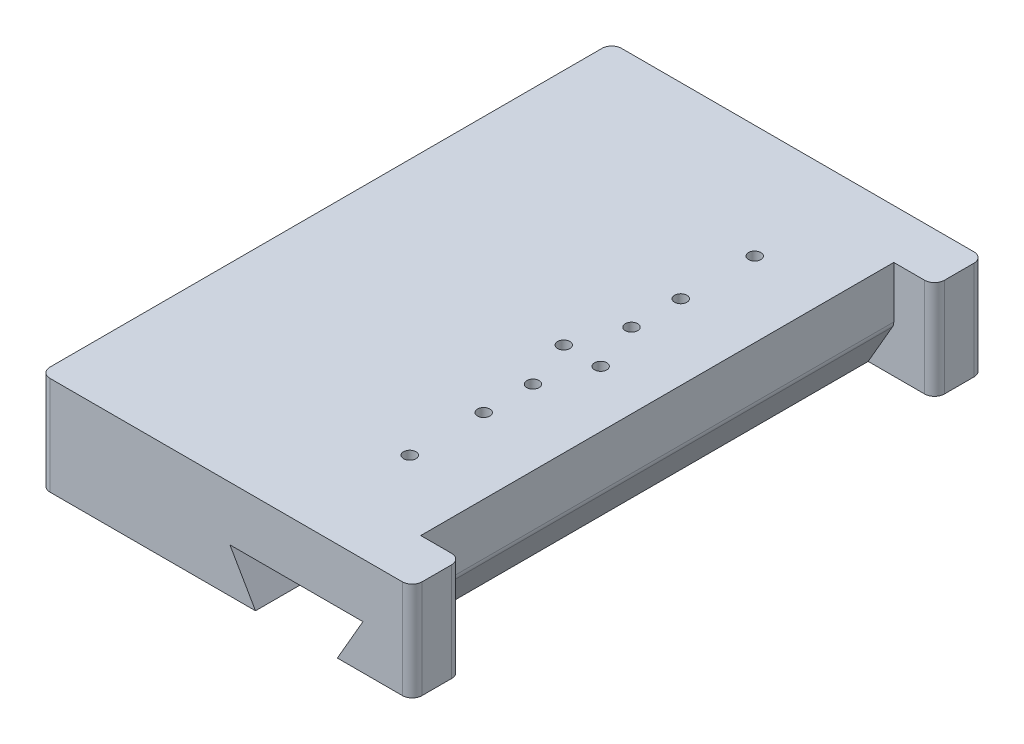
ISO-10303-21;
HEADER;
FILE_DESCRIPTION(('STEP AP214'),'2;1');
FILE_NAME('part.step','',(''),(''),'','','');
FILE_SCHEMA(('AUTOMOTIVE_DESIGN { 1 0 10303 214 1 1 1 1 }'));
ENDSEC;
DATA;
#1=APPLICATION_CONTEXT('core data for automotive mechanical design processes');
#2=APPLICATION_PROTOCOL_DEFINITION('international standard','automotive_design',2000,#1);
#3=PRODUCT_CONTEXT('',#1,'mechanical');
#4=PRODUCT('Part','Part','',(#3));
#5=PRODUCT_RELATED_PRODUCT_CATEGORY('part','',(#4));
#6=PRODUCT_DEFINITION_FORMATION('','',#4);
#7=PRODUCT_DEFINITION_CONTEXT('part definition',#1,'design');
#8=PRODUCT_DEFINITION('design','',#6,#7);
#9=PRODUCT_DEFINITION_SHAPE('','',#8);
#10=(LENGTH_UNIT() NAMED_UNIT(*) SI_UNIT(.MILLI.,.METRE.));
#11=(NAMED_UNIT(*) PLANE_ANGLE_UNIT() SI_UNIT($,.RADIAN.));
#12=(NAMED_UNIT(*) SI_UNIT($,.STERADIAN.) SOLID_ANGLE_UNIT());
#13=UNCERTAINTY_MEASURE_WITH_UNIT(LENGTH_MEASURE(1.E-05),#10,'distance_accuracy_value','');
#14=(GEOMETRIC_REPRESENTATION_CONTEXT(3) GLOBAL_UNCERTAINTY_ASSIGNED_CONTEXT((#13)) GLOBAL_UNIT_ASSIGNED_CONTEXT((#10,
#11,#12)) REPRESENTATION_CONTEXT('',''));
#15=CARTESIAN_POINT('',(0.,0.,0.));
#16=DIRECTION('',(0.,0.,1.));
#17=DIRECTION('',(1.,0.,0.));
#18=AXIS2_PLACEMENT_3D('',#15,#16,#17);
#19=CARTESIAN_POINT('',(0.,-20.,0.));
#20=DIRECTION('',(0.,1.,0.));
#21=DIRECTION('',(0.,0.,1.));
#22=AXIS2_PLACEMENT_3D('',#19,#20,#21);
#23=PLANE('',#22);
#24=DIRECTION('',(1.,0.,0.));
#25=VECTOR('',#24,1.);
#26=CARTESIAN_POINT('',(100.,-20.,48.));
#27=LINE('',#26,#25);
#28=CARTESIAN_POINT('',(62.0358983848623,-20.,48.));
#29=VERTEX_POINT('',#28);
#30=CARTESIAN_POINT('',(73.5,-20.,48.));
#31=VERTEX_POINT('',#30);
#32=EDGE_CURVE('E221',#29,#31,#27,.T.);
#33=ORIENTED_EDGE('',*,*,#32,.T.);
#34=CARTESIAN_POINT('',(73.5,-20.,50.));
#35=DIRECTION('',(0.,1.,0.));
#36=DIRECTION('',(0.,0.,1.));
#37=AXIS2_PLACEMENT_3D('',#34,#35,#36);
#38=CIRCLE('',#37,2.);
#39=CARTESIAN_POINT('',(75.5,-20.,50.));
#40=VERTEX_POINT('',#39);
#41=EDGE_CURVE('E410',#31,#40,#38,.F.);
#42=ORIENTED_EDGE('',*,*,#41,.T.);
#43=DIRECTION('',(0.,0.,1.));
#44=VECTOR('',#43,1.);
#45=CARTESIAN_POINT('',(75.5,-20.,-58.));
#46=LINE('',#45,#44);
#47=CARTESIAN_POINT('',(75.5,-20.,56.));
#48=VERTEX_POINT('',#47);
#49=EDGE_CURVE('E447',#40,#48,#46,.T.);
#50=ORIENTED_EDGE('',*,*,#49,.T.);
#51=CARTESIAN_POINT('',(73.5,-20.,56.));
#52=DIRECTION('',(0.,1.,0.));
#53=DIRECTION('',(0.,0.,1.));
#54=AXIS2_PLACEMENT_3D('',#51,#52,#53);
#55=CIRCLE('',#54,2.);
#56=CARTESIAN_POINT('',(73.5,-20.,58.));
#57=VERTEX_POINT('',#56);
#58=EDGE_CURVE('E60',#48,#57,#55,.F.);
#59=ORIENTED_EDGE('',*,*,#58,.T.);
#60=DIRECTION('',(-1.,0.,0.));
#61=VECTOR('',#60,1.);
#62=CARTESIAN_POINT('',(0.,-20.,58.));
#63=LINE('',#62,#61);
#64=CARTESIAN_POINT('',(60.3038475772934,-20.,58.));
#65=VERTEX_POINT('',#64);
#66=EDGE_CURVE('E294',#57,#65,#63,.T.);
#67=ORIENTED_EDGE('',*,*,#66,.T.);
#68=DIRECTION('',(0.,0.,-1.));
#69=VECTOR('',#68,1.);
#70=CARTESIAN_POINT('',(60.3038475772934,-20.,0.));
#71=LINE('',#70,#69);
#72=CARTESIAN_POINT('',(60.3038475772934,-20.,-58.));
#73=VERTEX_POINT('',#72);
#74=EDGE_CURVE('E339',#65,#73,#71,.T.);
#75=ORIENTED_EDGE('',*,*,#74,.T.);
#76=DIRECTION('',(-1.,0.,0.));
#77=VECTOR('',#76,1.);
#78=CARTESIAN_POINT('',(0.,-20.,-58.));
#79=LINE('',#78,#77);
#80=CARTESIAN_POINT('',(73.5,-20.,-58.));
#81=VERTEX_POINT('',#80);
#82=EDGE_CURVE('E285',#81,#73,#79,.T.);
#83=ORIENTED_EDGE('',*,*,#82,.F.);
#84=CARTESIAN_POINT('',(73.5,-20.,-56.));
#85=DIRECTION('',(0.,1.,0.));
#86=DIRECTION('',(0.,0.,1.));
#87=AXIS2_PLACEMENT_3D('',#84,#85,#86);
#88=CIRCLE('',#87,2.);
#89=CARTESIAN_POINT('',(75.5,-20.,-56.));
#90=VERTEX_POINT('',#89);
#91=EDGE_CURVE('E403',#81,#90,#88,.F.);
#92=ORIENTED_EDGE('',*,*,#91,.T.);
#93=CARTESIAN_POINT('',(75.5,-20.,-50.));
#94=VERTEX_POINT('',#93);
#95=EDGE_CURVE('E443',#90,#94,#46,.T.);
#96=ORIENTED_EDGE('',*,*,#95,.T.);
#97=CARTESIAN_POINT('',(73.5,-20.,-50.));
#98=DIRECTION('',(0.,1.,0.));
#99=DIRECTION('',(0.,0.,1.));
#100=AXIS2_PLACEMENT_3D('',#97,#98,#99);
#101=CIRCLE('',#100,2.);
#102=CARTESIAN_POINT('',(73.5,-20.,-48.));
#103=VERTEX_POINT('',#102);
#104=EDGE_CURVE('E67',#94,#103,#101,.F.);
#105=ORIENTED_EDGE('',*,*,#104,.T.);
#106=DIRECTION('',(-1.,0.,0.));
#107=VECTOR('',#106,1.);
#108=CARTESIAN_POINT('',(100.,-20.,-48.));
#109=LINE('',#108,#107);
#110=CARTESIAN_POINT('',(62.0358983848623,-20.,-48.));
#111=VERTEX_POINT('',#110);
#112=EDGE_CURVE('E179',#103,#111,#109,.T.);
#113=ORIENTED_EDGE('',*,*,#112,.T.);
#114=DIRECTION('',(0.,0.,-1.));
#115=VECTOR('',#114,1.);
#116=CARTESIAN_POINT('',(62.0358983848624,-20.,100.910057229565));
#117=LINE('',#116,#115);
#118=EDGE_CURVE('E182',#29,#111,#117,.T.);
#119=ORIENTED_EDGE('',*,*,#118,.F.);
#120=EDGE_LOOP('',(#33,#42,#50,#59,#67,#75,#83,#92,#96,#105,#113,#119));
#121=FACE_BOUND('',#120,.T.);
#122=ADVANCED_FACE('F44',(#121),#23,.F.);
#123=CARTESIAN_POINT('',(0.,-20.,-58.));
#124=DIRECTION('',(0.,0.,-1.));
#125=DIRECTION('',(-1.,0.,0.));
#126=AXIS2_PLACEMENT_3D('',#123,#124,#125);
#127=PLANE('',#126);
#128=DIRECTION('',(-1.,0.,0.));
#129=VECTOR('',#128,1.);
#130=CARTESIAN_POINT('',(0.,0.,-58.));
#131=LINE('',#130,#129);
#132=CARTESIAN_POINT('',(73.5,0.,-58.));
#133=VERTEX_POINT('',#132);
#134=CARTESIAN_POINT('',(2.,0.,-58.));
#135=VERTEX_POINT('',#134);
#136=EDGE_CURVE('E281',#133,#135,#131,.T.);
#137=ORIENTED_EDGE('',*,*,#136,.F.);
#138=DIRECTION('',(0.,-1.,0.));
#139=VECTOR('',#138,1.);
#140=CARTESIAN_POINT('',(73.5,-20.,-58.));
#141=LINE('',#140,#139);
#142=EDGE_CURVE('E425',#133,#81,#141,.T.);
#143=ORIENTED_EDGE('',*,*,#142,.T.);
#144=ORIENTED_EDGE('',*,*,#82,.T.);
#145=DIRECTION('',(0.499999999999995,0.866025403784442,0.));
#146=VECTOR('',#145,1.);
#147=CARTESIAN_POINT('',(65.5,-11.,-58.));
#148=LINE('',#147,#146);
#149=CARTESIAN_POINT('',(65.5,-11.,-58.));
#150=VERTEX_POINT('',#149);
#151=EDGE_CURVE('E263',#73,#150,#148,.T.);
#152=ORIENTED_EDGE('',*,*,#151,.T.);
#153=DIRECTION('',(-1.,0.,0.));
#154=VECTOR('',#153,1.);
#155=CARTESIAN_POINT('',(38.7886751345948,-11.,-58.));
#156=LINE('',#155,#154);
#157=CARTESIAN_POINT('',(38.5,-11.,-58.));
#158=VERTEX_POINT('',#157);
#159=EDGE_CURVE('E254',#150,#158,#156,.T.);
#160=ORIENTED_EDGE('',*,*,#159,.T.);
#161=DIRECTION('',(0.499999999999995,-0.866025403784442,0.));
#162=VECTOR('',#161,1.);
#163=CARTESIAN_POINT('',(38.5,-11.,-58.));
#164=LINE('',#163,#162);
#165=CARTESIAN_POINT('',(43.6961524227066,-20.,-58.));
#166=VERTEX_POINT('',#165);
#167=EDGE_CURVE('E258',#158,#166,#164,.T.);
#168=ORIENTED_EDGE('',*,*,#167,.T.);
#169=CARTESIAN_POINT('',(2.,-20.,-58.));
#170=VERTEX_POINT('',#169);
#171=EDGE_CURVE('E289',#166,#170,#79,.T.);
#172=ORIENTED_EDGE('',*,*,#171,.T.);
#173=DIRECTION('',(0.,1.,0.));
#174=VECTOR('',#173,1.);
#175=CARTESIAN_POINT('',(2.,-20.,-58.));
#176=LINE('',#175,#174);
#177=EDGE_CURVE('E297',#170,#135,#176,.T.);
#178=ORIENTED_EDGE('',*,*,#177,.T.);
#179=EDGE_LOOP('',(#137,#143,#144,#152,#160,#168,#172,#178));
#180=FACE_BOUND('',#179,.T.);
#181=ADVANCED_FACE('F490',(#180),#127,.T.);
#182=CARTESIAN_POINT('',(0.,-20.,58.));
#183=DIRECTION('',(0.,0.,-1.));
#184=DIRECTION('',(-1.,0.,0.));
#185=AXIS2_PLACEMENT_3D('',#182,#183,#184);
#186=PLANE('',#185);
#187=ORIENTED_EDGE('',*,*,#66,.F.);
#188=DIRECTION('',(0.,-1.,0.));
#189=VECTOR('',#188,1.);
#190=CARTESIAN_POINT('',(73.5,-20.,58.));
#191=LINE('',#190,#189);
#192=CARTESIAN_POINT('',(73.5,0.,58.));
#193=VERTEX_POINT('',#192);
#194=EDGE_CURVE('E422',#57,#193,#191,.F.);
#195=ORIENTED_EDGE('',*,*,#194,.T.);
#196=DIRECTION('',(-1.,0.,0.));
#197=VECTOR('',#196,1.);
#198=CARTESIAN_POINT('',(0.,0.,58.));
#199=LINE('',#198,#197);
#200=CARTESIAN_POINT('',(2.,0.,58.));
#201=VERTEX_POINT('',#200);
#202=EDGE_CURVE('E304',#193,#201,#199,.T.);
#203=ORIENTED_EDGE('',*,*,#202,.T.);
#204=DIRECTION('',(0.,1.,0.));
#205=VECTOR('',#204,1.);
#206=CARTESIAN_POINT('',(2.,-20.,58.));
#207=LINE('',#206,#205);
#208=CARTESIAN_POINT('',(2.,-20.,58.));
#209=VERTEX_POINT('',#208);
#210=EDGE_CURVE('E331',#201,#209,#207,.F.);
#211=ORIENTED_EDGE('',*,*,#210,.T.);
#212=CARTESIAN_POINT('',(43.6961524227066,-20.,58.));
#213=VERTEX_POINT('',#212);
#214=EDGE_CURVE('E293',#213,#209,#63,.T.);
#215=ORIENTED_EDGE('',*,*,#214,.F.);
#216=DIRECTION('',(0.499999999999995,-0.866025403784442,0.));
#217=VECTOR('',#216,1.);
#218=CARTESIAN_POINT('',(38.5,-11.,58.));
#219=LINE('',#218,#217);
#220=CARTESIAN_POINT('',(38.5,-11.,58.));
#221=VERTEX_POINT('',#220);
#222=EDGE_CURVE('E268',#221,#213,#219,.T.);
#223=ORIENTED_EDGE('',*,*,#222,.F.);
#224=DIRECTION('',(-1.,0.,0.));
#225=VECTOR('',#224,1.);
#226=CARTESIAN_POINT('',(38.7886751345948,-11.,58.));
#227=LINE('',#226,#225);
#228=CARTESIAN_POINT('',(65.5,-11.,58.));
#229=VERTEX_POINT('',#228);
#230=EDGE_CURVE('E259',#229,#221,#227,.T.);
#231=ORIENTED_EDGE('',*,*,#230,.F.);
#232=DIRECTION('',(0.499999999999995,0.866025403784442,0.));
#233=VECTOR('',#232,1.);
#234=CARTESIAN_POINT('',(65.5,-11.,58.));
#235=LINE('',#234,#233);
#236=EDGE_CURVE('E271',#65,#229,#235,.T.);
#237=ORIENTED_EDGE('',*,*,#236,.F.);
#238=EDGE_LOOP('',(#187,#195,#203,#211,#215,#223,#231,#237));
#239=FACE_BOUND('',#238,.T.);
#240=ADVANCED_FACE('F468',(#239),#186,.F.);
#241=CARTESIAN_POINT('',(0.,-20.,0.));
#242=DIRECTION('',(-1.,0.,0.));
#243=DIRECTION('',(0.,0.,1.));
#244=AXIS2_PLACEMENT_3D('',#241,#242,#243);
#245=PLANE('',#244);
#246=DIRECTION('',(0.,0.,1.));
#247=VECTOR('',#246,1.);
#248=CARTESIAN_POINT('',(0.,0.,0.));
#249=LINE('',#248,#247);
#250=CARTESIAN_POINT('',(0.,0.,-56.));
#251=VERTEX_POINT('',#250);
#252=CARTESIAN_POINT('',(0.,0.,56.));
#253=VERTEX_POINT('',#252);
#254=EDGE_CURVE('E300',#251,#253,#249,.T.);
#255=ORIENTED_EDGE('',*,*,#254,.F.);
#256=DIRECTION('',(0.,1.,0.));
#257=VECTOR('',#256,1.);
#258=CARTESIAN_POINT('',(0.,-20.,-56.));
#259=LINE('',#258,#257);
#260=CARTESIAN_POINT('',(0.,-20.,-56.));
#261=VERTEX_POINT('',#260);
#262=EDGE_CURVE('E321',#251,#261,#259,.F.);
#263=ORIENTED_EDGE('',*,*,#262,.T.);
#264=DIRECTION('',(0.,0.,1.));
#265=VECTOR('',#264,1.);
#266=CARTESIAN_POINT('',(0.,-20.,0.));
#267=LINE('',#266,#265);
#268=CARTESIAN_POINT('',(0.,-20.,56.));
#269=VERTEX_POINT('',#268);
#270=EDGE_CURVE('E288',#261,#269,#267,.T.);
#271=ORIENTED_EDGE('',*,*,#270,.T.);
#272=DIRECTION('',(0.,1.,0.));
#273=VECTOR('',#272,1.);
#274=CARTESIAN_POINT('',(0.,0.,56.));
#275=LINE('',#274,#273);
#276=EDGE_CURVE('E317',#269,#253,#275,.T.);
#277=ORIENTED_EDGE('',*,*,#276,.T.);
#278=EDGE_LOOP('',(#255,#263,#271,#277));
#279=FACE_BOUND('',#278,.T.);
#280=ADVANCED_FACE('F536',(#279),#245,.T.);
#281=ORIENTED_EDGE('',*,*,#171,.F.);
#282=DIRECTION('',(0.,0.,1.));
#283=VECTOR('',#282,1.);
#284=CARTESIAN_POINT('',(43.6961524227066,-20.,0.));
#285=LINE('',#284,#283);
#286=EDGE_CURVE('E335',#166,#213,#285,.T.);
#287=ORIENTED_EDGE('',*,*,#286,.T.);
#288=ORIENTED_EDGE('',*,*,#214,.T.);
#289=CARTESIAN_POINT('',(2.,-20.,56.));
#290=DIRECTION('',(0.,1.,0.));
#291=DIRECTION('',(0.,0.,1.));
#292=AXIS2_PLACEMENT_3D('',#289,#290,#291);
#293=CIRCLE('',#292,2.);
#294=EDGE_CURVE('E324',#209,#269,#293,.F.);
#295=ORIENTED_EDGE('',*,*,#294,.T.);
#296=ORIENTED_EDGE('',*,*,#270,.F.);
#297=CARTESIAN_POINT('',(2.,-20.,-56.));
#298=DIRECTION('',(0.,1.,0.));
#299=DIRECTION('',(0.,0.,1.));
#300=AXIS2_PLACEMENT_3D('',#297,#298,#299);
#301=CIRCLE('',#300,2.);
#302=EDGE_CURVE('E327',#261,#170,#301,.F.);
#303=ORIENTED_EDGE('',*,*,#302,.T.);
#304=EDGE_LOOP('',(#281,#287,#288,#295,#296,#303));
#305=FACE_BOUND('',#304,.T.);
#306=ADVANCED_FACE('F483',(#305),#23,.F.);
#307=CARTESIAN_POINT('',(0.,0.,0.));
#308=DIRECTION('',(0.,1.,0.));
#309=DIRECTION('',(0.,0.,1.));
#310=AXIS2_PLACEMENT_3D('',#307,#308,#309);
#311=PLANE('',#310);
#312=DIRECTION('',(0.,0.,1.));
#313=VECTOR('',#312,1.);
#314=CARTESIAN_POINT('',(75.5,0.,-58.));
#315=LINE('',#314,#313);
#316=CARTESIAN_POINT('',(75.5,0.,50.));
#317=VERTEX_POINT('',#316);
#318=CARTESIAN_POINT('',(75.5,0.,56.));
#319=VERTEX_POINT('',#318);
#320=EDGE_CURVE('E446',#317,#319,#315,.T.);
#321=ORIENTED_EDGE('',*,*,#320,.F.);
#322=CARTESIAN_POINT('',(73.5,0.,50.));
#323=DIRECTION('',(0.,1.,0.));
#324=DIRECTION('',(0.,0.,1.));
#325=AXIS2_PLACEMENT_3D('',#322,#323,#324);
#326=CIRCLE('',#325,2.);
#327=CARTESIAN_POINT('',(73.5,0.,48.));
#328=VERTEX_POINT('',#327);
#329=EDGE_CURVE('E397',#317,#328,#326,.T.);
#330=ORIENTED_EDGE('',*,*,#329,.T.);
#331=DIRECTION('',(-1.,0.,0.));
#332=VECTOR('',#331,1.);
#333=CARTESIAN_POINT('',(67.232050807569,0.,48.));
#334=LINE('',#333,#332);
#335=CARTESIAN_POINT('',(67.232050807569,0.,48.));
#336=VERTEX_POINT('',#335);
#337=EDGE_CURVE('E433',#328,#336,#334,.T.);
#338=ORIENTED_EDGE('',*,*,#337,.T.);
#339=DIRECTION('',(0.,0.,-1.));
#340=VECTOR('',#339,1.);
#341=CARTESIAN_POINT('',(67.232050807569,0.,100.910057229565));
#342=LINE('',#341,#340);
#343=CARTESIAN_POINT('',(67.2320508075689,0.,-48.));
#344=VERTEX_POINT('',#343);
#345=EDGE_CURVE('E199',#336,#344,#342,.T.);
#346=ORIENTED_EDGE('',*,*,#345,.T.);
#347=DIRECTION('',(1.,0.,0.));
#348=VECTOR('',#347,1.);
#349=CARTESIAN_POINT('',(67.2320508075689,0.,-48.));
#350=LINE('',#349,#348);
#351=CARTESIAN_POINT('',(73.5,0.,-48.));
#352=VERTEX_POINT('',#351);
#353=EDGE_CURVE('E200',#344,#352,#350,.T.);
#354=ORIENTED_EDGE('',*,*,#353,.T.);
#355=CARTESIAN_POINT('',(73.5,0.,-50.));
#356=DIRECTION('',(0.,1.,0.));
#357=DIRECTION('',(0.,0.,1.));
#358=AXIS2_PLACEMENT_3D('',#355,#356,#357);
#359=CIRCLE('',#358,2.);
#360=CARTESIAN_POINT('',(75.5,0.,-50.));
#361=VERTEX_POINT('',#360);
#362=EDGE_CURVE('E394',#352,#361,#359,.T.);
#363=ORIENTED_EDGE('',*,*,#362,.T.);
#364=CARTESIAN_POINT('',(75.5,0.,-56.));
#365=VERTEX_POINT('',#364);
#366=EDGE_CURVE('E189',#365,#361,#315,.T.);
#367=ORIENTED_EDGE('',*,*,#366,.F.);
#368=CARTESIAN_POINT('',(73.5,0.,-56.));
#369=DIRECTION('',(0.,1.,0.));
#370=DIRECTION('',(0.,0.,1.));
#371=AXIS2_PLACEMENT_3D('',#368,#369,#370);
#372=CIRCLE('',#371,2.);
#373=EDGE_CURVE('E388',#365,#133,#372,.T.);
#374=ORIENTED_EDGE('',*,*,#373,.T.);
#375=ORIENTED_EDGE('',*,*,#136,.T.);
#376=CARTESIAN_POINT('',(2.,0.,-56.));
#377=DIRECTION('',(0.,1.,0.));
#378=DIRECTION('',(0.,0.,1.));
#379=AXIS2_PLACEMENT_3D('',#376,#377,#378);
#380=CIRCLE('',#379,2.);
#381=EDGE_CURVE('E314',#135,#251,#380,.T.);
#382=ORIENTED_EDGE('',*,*,#381,.T.);
#383=ORIENTED_EDGE('',*,*,#254,.T.);
#384=CARTESIAN_POINT('',(2.,0.,56.));
#385=DIRECTION('',(0.,1.,0.));
#386=DIRECTION('',(0.,0.,1.));
#387=AXIS2_PLACEMENT_3D('',#384,#385,#386);
#388=CIRCLE('',#387,2.);
#389=EDGE_CURVE('E310',#253,#201,#388,.T.);
#390=ORIENTED_EDGE('',*,*,#389,.T.);
#391=ORIENTED_EDGE('',*,*,#202,.F.);
#392=CARTESIAN_POINT('',(73.5,0.,56.));
#393=DIRECTION('',(0.,1.,0.));
#394=DIRECTION('',(0.,0.,1.));
#395=AXIS2_PLACEMENT_3D('',#392,#393,#394);
#396=CIRCLE('',#395,2.);
#397=EDGE_CURVE('E391',#193,#319,#396,.T.);
#398=ORIENTED_EDGE('',*,*,#397,.T.);
#399=EDGE_LOOP('',(#321,#330,#338,#346,#354,#363,#367,#374,#375,#382,#383,#390,#391,#398));
#400=FACE_BOUND('',#399,.T.);
#401=CARTESIAN_POINT('',(52.,0.,10.));
#402=DIRECTION('',(0.,1.,0.));
#403=DIRECTION('',(0.,0.,-1.));
#404=AXIS2_PLACEMENT_3D('',#401,#402,#403);
#405=CIRCLE('',#404,1.25);
#406=CARTESIAN_POINT('',(52.,0.,8.75));
#407=VERTEX_POINT('',#406);
#408=EDGE_CURVE('E220',#407,#407,#405,.T.);
#409=ORIENTED_EDGE('',*,*,#408,.F.);
#410=EDGE_LOOP('',(#409));
#411=FACE_BOUND('',#410,.T.);
#412=CARTESIAN_POINT('',(52.,0.,20.));
#413=DIRECTION('',(0.,1.,0.));
#414=DIRECTION('',(0.,0.,-1.));
#415=AXIS2_PLACEMENT_3D('',#412,#413,#414);
#416=CIRCLE('',#415,1.25);
#417=CARTESIAN_POINT('',(52.,0.,18.75));
#418=VERTEX_POINT('',#417);
#419=EDGE_CURVE('E243',#418,#418,#416,.T.);
#420=ORIENTED_EDGE('',*,*,#419,.F.);
#421=EDGE_LOOP('',(#420));
#422=FACE_BOUND('',#421,.T.);
#423=CARTESIAN_POINT('',(52.,0.,35.));
#424=DIRECTION('',(0.,1.,0.));
#425=DIRECTION('',(0.,0.,-1.));
#426=AXIS2_PLACEMENT_3D('',#423,#424,#425);
#427=CIRCLE('',#426,1.25);
#428=CARTESIAN_POINT('',(52.,0.,33.75));
#429=VERTEX_POINT('',#428);
#430=EDGE_CURVE('E231',#429,#429,#427,.T.);
#431=ORIENTED_EDGE('',*,*,#430,.F.);
#432=EDGE_LOOP('',(#431));
#433=FACE_BOUND('',#432,.T.);
#434=CARTESIAN_POINT('',(52.,0.,-20.));
#435=DIRECTION('',(0.,1.,0.));
#436=DIRECTION('',(0.,0.,1.));
#437=AXIS2_PLACEMENT_3D('',#434,#435,#436);
#438=CIRCLE('',#437,1.25);
#439=CARTESIAN_POINT('',(52.,0.,-18.75));
#440=VERTEX_POINT('',#439);
#441=EDGE_CURVE('E232',#440,#440,#438,.T.);
#442=ORIENTED_EDGE('',*,*,#441,.F.);
#443=EDGE_LOOP('',(#442));
#444=FACE_BOUND('',#443,.T.);
#445=CARTESIAN_POINT('',(48.25,0.,0.));
#446=DIRECTION('',(0.,1.,0.));
#447=DIRECTION('',(0.,0.,1.));
#448=AXIS2_PLACEMENT_3D('',#445,#446,#447);
#449=CIRCLE('',#448,1.25);
#450=CARTESIAN_POINT('',(48.25,0.,1.25));
#451=VERTEX_POINT('',#450);
#452=EDGE_CURVE('E226',#451,#451,#449,.T.);
#453=ORIENTED_EDGE('',*,*,#452,.F.);
#454=EDGE_LOOP('',(#453));
#455=FACE_BOUND('',#454,.T.);
#456=CARTESIAN_POINT('',(55.75,0.,0.));
#457=DIRECTION('',(0.,1.,0.));
#458=DIRECTION('',(0.,0.,1.));
#459=AXIS2_PLACEMENT_3D('',#456,#457,#458);
#460=CIRCLE('',#459,1.25);
#461=CARTESIAN_POINT('',(55.75,0.,1.25));
#462=VERTEX_POINT('',#461);
#463=EDGE_CURVE('E222',#462,#462,#460,.T.);
#464=ORIENTED_EDGE('',*,*,#463,.F.);
#465=EDGE_LOOP('',(#464));
#466=FACE_BOUND('',#465,.T.);
#467=CARTESIAN_POINT('',(52.,0.,-35.));
#468=DIRECTION('',(0.,1.,0.));
#469=DIRECTION('',(0.,0.,1.));
#470=AXIS2_PLACEMENT_3D('',#467,#468,#469);
#471=CIRCLE('',#470,1.25);
#472=CARTESIAN_POINT('',(52.,0.,-33.75));
#473=VERTEX_POINT('',#472);
#474=EDGE_CURVE('E227',#473,#473,#471,.T.);
#475=ORIENTED_EDGE('',*,*,#474,.F.);
#476=EDGE_LOOP('',(#475));
#477=FACE_BOUND('',#476,.T.);
#478=CARTESIAN_POINT('',(52.,0.,-10.));
#479=DIRECTION('',(0.,1.,0.));
#480=DIRECTION('',(0.,0.,1.));
#481=AXIS2_PLACEMENT_3D('',#478,#479,#480);
#482=CIRCLE('',#481,1.25);
#483=CARTESIAN_POINT('',(52.,0.,-8.75));
#484=VERTEX_POINT('',#483);
#485=EDGE_CURVE('E236',#484,#484,#482,.T.);
#486=ORIENTED_EDGE('',*,*,#485,.F.);
#487=EDGE_LOOP('',(#486));
#488=FACE_BOUND('',#487,.T.);
#489=ADVANCED_FACE('F470',(#400,#411,#422,#433,#444,#455,#466,#477,#488),#311,.T.);
#490=CARTESIAN_POINT('',(2.,-20.,-56.));
#491=DIRECTION('',(0.,1.,0.));
#492=DIRECTION('',(0.,0.,1.));
#493=AXIS2_PLACEMENT_3D('',#490,#491,#492);
#494=CYLINDRICAL_SURFACE('',#493,2.);
#495=ORIENTED_EDGE('',*,*,#302,.F.);
#496=ORIENTED_EDGE('',*,*,#262,.F.);
#497=ORIENTED_EDGE('',*,*,#381,.F.);
#498=ORIENTED_EDGE('',*,*,#177,.F.);
#499=EDGE_LOOP('',(#495,#496,#497,#498));
#500=FACE_BOUND('',#499,.T.);
#501=ADVANCED_FACE('F541',(#500),#494,.T.);
#502=CARTESIAN_POINT('',(2.,-20.,56.));
#503=DIRECTION('',(0.,-1.,0.));
#504=DIRECTION('',(0.,0.,-1.));
#505=AXIS2_PLACEMENT_3D('',#502,#503,#504);
#506=CYLINDRICAL_SURFACE('',#505,2.);
#507=ORIENTED_EDGE('',*,*,#294,.F.);
#508=ORIENTED_EDGE('',*,*,#210,.F.);
#509=ORIENTED_EDGE('',*,*,#389,.F.);
#510=ORIENTED_EDGE('',*,*,#276,.F.);
#511=EDGE_LOOP('',(#507,#508,#509,#510));
#512=FACE_BOUND('',#511,.T.);
#513=ADVANCED_FACE('F477',(#512),#506,.T.);
#514=CARTESIAN_POINT('',(65.5,-11.,-58.));
#515=DIRECTION('',(0.866025403784442,-0.499999999999995,0.));
#516=DIRECTION('',(0.499999999999995,0.866025403784442,0.));
#517=AXIS2_PLACEMENT_3D('',#514,#515,#516);
#518=PLANE('',#517);
#519=ORIENTED_EDGE('',*,*,#236,.T.);
#520=DIRECTION('',(0.,0.,1.));
#521=VECTOR('',#520,1.);
#522=CARTESIAN_POINT('',(65.5,-11.,-58.));
#523=LINE('',#522,#521);
#524=EDGE_CURVE('E277',#150,#229,#523,.T.);
#525=ORIENTED_EDGE('',*,*,#524,.F.);
#526=ORIENTED_EDGE('',*,*,#151,.F.);
#527=ORIENTED_EDGE('',*,*,#74,.F.);
#528=EDGE_LOOP('',(#519,#525,#526,#527));
#529=FACE_BOUND('',#528,.T.);
#530=ADVANCED_FACE('F496',(#529),#518,.F.);
#531=CARTESIAN_POINT('',(38.5,-11.,-58.));
#532=DIRECTION('',(-0.866025403784441,-0.499999999999995,0.));
#533=DIRECTION('',(0.499999999999995,-0.866025403784442,0.));
#534=AXIS2_PLACEMENT_3D('',#531,#532,#533);
#535=PLANE('',#534);
#536=ORIENTED_EDGE('',*,*,#167,.F.);
#537=DIRECTION('',(0.,0.,1.));
#538=VECTOR('',#537,1.);
#539=CARTESIAN_POINT('',(38.5,-11.,-58.));
#540=LINE('',#539,#538);
#541=EDGE_CURVE('E267',#158,#221,#540,.T.);
#542=ORIENTED_EDGE('',*,*,#541,.T.);
#543=ORIENTED_EDGE('',*,*,#222,.T.);
#544=ORIENTED_EDGE('',*,*,#286,.F.);
#545=EDGE_LOOP('',(#536,#542,#543,#544));
#546=FACE_BOUND('',#545,.T.);
#547=ADVANCED_FACE('F487',(#546),#535,.F.);
#548=CARTESIAN_POINT('',(38.7886751345948,-11.,-58.));
#549=DIRECTION('',(0.,1.,0.));
#550=DIRECTION('',(-1.,0.,0.));
#551=AXIS2_PLACEMENT_3D('',#548,#549,#550);
#552=PLANE('',#551);
#553=CARTESIAN_POINT('',(52.,-11.,10.));
#554=DIRECTION('',(0.,1.,0.));
#555=DIRECTION('',(-1.,0.,0.));
#556=AXIS2_PLACEMENT_3D('',#553,#554,#555);
#557=CIRCLE('',#556,1.25);
#558=CARTESIAN_POINT('',(50.75,-11.,10.));
#559=VERTEX_POINT('',#558);
#560=EDGE_CURVE('E272',#559,#559,#557,.T.);
#561=ORIENTED_EDGE('',*,*,#560,.T.);
#562=EDGE_LOOP('',(#561));
#563=FACE_BOUND('',#562,.T.);
#564=CARTESIAN_POINT('',(52.,-11.,20.));
#565=DIRECTION('',(0.,1.,0.));
#566=DIRECTION('',(-1.,0.,0.));
#567=AXIS2_PLACEMENT_3D('',#564,#565,#566);
#568=CIRCLE('',#567,1.25);
#569=CARTESIAN_POINT('',(50.75,-11.,20.));
#570=VERTEX_POINT('',#569);
#571=EDGE_CURVE('E367',#570,#570,#568,.T.);
#572=ORIENTED_EDGE('',*,*,#571,.T.);
#573=EDGE_LOOP('',(#572));
#574=FACE_BOUND('',#573,.T.);
#575=CARTESIAN_POINT('',(52.,-11.,35.));
#576=DIRECTION('',(0.,1.,0.));
#577=DIRECTION('',(-1.,0.,0.));
#578=AXIS2_PLACEMENT_3D('',#575,#576,#577);
#579=CIRCLE('',#578,1.25);
#580=CARTESIAN_POINT('',(50.75,-11.,35.));
#581=VERTEX_POINT('',#580);
#582=EDGE_CURVE('E363',#581,#581,#579,.T.);
#583=ORIENTED_EDGE('',*,*,#582,.T.);
#584=EDGE_LOOP('',(#583));
#585=FACE_BOUND('',#584,.T.);
#586=CARTESIAN_POINT('',(52.,-11.,-20.));
#587=DIRECTION('',(0.,1.,0.));
#588=DIRECTION('',(-1.,0.,0.));
#589=AXIS2_PLACEMENT_3D('',#586,#587,#588);
#590=CIRCLE('',#589,1.25);
#591=CARTESIAN_POINT('',(50.75,-11.,-20.));
#592=VERTEX_POINT('',#591);
#593=EDGE_CURVE('E359',#592,#592,#590,.T.);
#594=ORIENTED_EDGE('',*,*,#593,.T.);
#595=EDGE_LOOP('',(#594));
#596=FACE_BOUND('',#595,.T.);
#597=CARTESIAN_POINT('',(48.25,-11.,0.));
#598=DIRECTION('',(0.,1.,0.));
#599=DIRECTION('',(-1.,0.,0.));
#600=AXIS2_PLACEMENT_3D('',#597,#598,#599);
#601=CIRCLE('',#600,1.25);
#602=CARTESIAN_POINT('',(47.,-11.,0.));
#603=VERTEX_POINT('',#602);
#604=EDGE_CURVE('E355',#603,#603,#601,.T.);
#605=ORIENTED_EDGE('',*,*,#604,.T.);
#606=EDGE_LOOP('',(#605));
#607=FACE_BOUND('',#606,.T.);
#608=CARTESIAN_POINT('',(55.75,-11.,0.));
#609=DIRECTION('',(0.,1.,0.));
#610=DIRECTION('',(-1.,0.,0.));
#611=AXIS2_PLACEMENT_3D('',#608,#609,#610);
#612=CIRCLE('',#611,1.25);
#613=CARTESIAN_POINT('',(54.5,-11.,0.));
#614=VERTEX_POINT('',#613);
#615=EDGE_CURVE('E351',#614,#614,#612,.T.);
#616=ORIENTED_EDGE('',*,*,#615,.T.);
#617=EDGE_LOOP('',(#616));
#618=FACE_BOUND('',#617,.T.);
#619=CARTESIAN_POINT('',(52.,-11.,-35.));
#620=DIRECTION('',(0.,1.,0.));
#621=DIRECTION('',(-1.,0.,0.));
#622=AXIS2_PLACEMENT_3D('',#619,#620,#621);
#623=CIRCLE('',#622,1.25);
#624=CARTESIAN_POINT('',(50.75,-11.,-35.));
#625=VERTEX_POINT('',#624);
#626=EDGE_CURVE('E347',#625,#625,#623,.T.);
#627=ORIENTED_EDGE('',*,*,#626,.T.);
#628=EDGE_LOOP('',(#627));
#629=FACE_BOUND('',#628,.T.);
#630=CARTESIAN_POINT('',(52.,-11.,-10.));
#631=DIRECTION('',(0.,1.,0.));
#632=DIRECTION('',(-1.,0.,0.));
#633=AXIS2_PLACEMENT_3D('',#630,#631,#632);
#634=CIRCLE('',#633,1.25);
#635=CARTESIAN_POINT('',(50.75,-11.,-10.));
#636=VERTEX_POINT('',#635);
#637=EDGE_CURVE('E253',#636,#636,#634,.T.);
#638=ORIENTED_EDGE('',*,*,#637,.T.);
#639=EDGE_LOOP('',(#638));
#640=FACE_BOUND('',#639,.T.);
#641=ORIENTED_EDGE('',*,*,#230,.T.);
#642=ORIENTED_EDGE('',*,*,#541,.F.);
#643=ORIENTED_EDGE('',*,*,#159,.F.);
#644=ORIENTED_EDGE('',*,*,#524,.T.);
#645=EDGE_LOOP('',(#641,#642,#643,#644));
#646=FACE_BOUND('',#645,.T.);
#647=ADVANCED_FACE('F494',(#563,#574,#585,#596,#607,#618,#629,#640,#646),#552,.F.);
#648=CARTESIAN_POINT('',(52.,-20.,-10.));
#649=DIRECTION('',(0.,1.,0.));
#650=DIRECTION('',(0.,0.,1.));
#651=AXIS2_PLACEMENT_3D('',#648,#649,#650);
#652=CYLINDRICAL_SURFACE('',#651,1.25);
#653=ORIENTED_EDGE('',*,*,#485,.T.);
#654=EDGE_LOOP('',(#653));
#655=FACE_BOUND('',#654,.T.);
#656=ORIENTED_EDGE('',*,*,#637,.F.);
#657=EDGE_LOOP('',(#656));
#658=FACE_BOUND('',#657,.T.);
#659=ADVANCED_FACE('F562',(#655,#658),#652,.F.);
#660=CARTESIAN_POINT('',(52.,-20.,-35.));
#661=DIRECTION('',(0.,1.,0.));
#662=DIRECTION('',(0.,0.,1.));
#663=AXIS2_PLACEMENT_3D('',#660,#661,#662);
#664=CYLINDRICAL_SURFACE('',#663,1.25);
#665=ORIENTED_EDGE('',*,*,#474,.T.);
#666=EDGE_LOOP('',(#665));
#667=FACE_BOUND('',#666,.T.);
#668=ORIENTED_EDGE('',*,*,#626,.F.);
#669=EDGE_LOOP('',(#668));
#670=FACE_BOUND('',#669,.T.);
#671=ADVANCED_FACE('F566',(#667,#670),#664,.F.);
#672=CARTESIAN_POINT('',(55.75,-20.,0.));
#673=DIRECTION('',(0.,1.,0.));
#674=DIRECTION('',(0.,0.,1.));
#675=AXIS2_PLACEMENT_3D('',#672,#673,#674);
#676=CYLINDRICAL_SURFACE('',#675,1.25);
#677=ORIENTED_EDGE('',*,*,#463,.T.);
#678=EDGE_LOOP('',(#677));
#679=FACE_BOUND('',#678,.T.);
#680=ORIENTED_EDGE('',*,*,#615,.F.);
#681=EDGE_LOOP('',(#680));
#682=FACE_BOUND('',#681,.T.);
#683=ADVANCED_FACE('F584',(#679,#682),#676,.F.);
#684=CARTESIAN_POINT('',(48.25,-20.,0.));
#685=DIRECTION('',(0.,1.,0.));
#686=DIRECTION('',(0.,0.,1.));
#687=AXIS2_PLACEMENT_3D('',#684,#685,#686);
#688=CYLINDRICAL_SURFACE('',#687,1.25);
#689=ORIENTED_EDGE('',*,*,#452,.T.);
#690=EDGE_LOOP('',(#689));
#691=FACE_BOUND('',#690,.T.);
#692=ORIENTED_EDGE('',*,*,#604,.F.);
#693=EDGE_LOOP('',(#692));
#694=FACE_BOUND('',#693,.T.);
#695=ADVANCED_FACE('F581',(#691,#694),#688,.F.);
#696=CARTESIAN_POINT('',(52.,-20.,-20.));
#697=DIRECTION('',(0.,1.,0.));
#698=DIRECTION('',(0.,0.,1.));
#699=AXIS2_PLACEMENT_3D('',#696,#697,#698);
#700=CYLINDRICAL_SURFACE('',#699,1.25);
#701=ORIENTED_EDGE('',*,*,#441,.T.);
#702=EDGE_LOOP('',(#701));
#703=FACE_BOUND('',#702,.T.);
#704=ORIENTED_EDGE('',*,*,#593,.F.);
#705=EDGE_LOOP('',(#704));
#706=FACE_BOUND('',#705,.T.);
#707=ADVANCED_FACE('F579',(#703,#706),#700,.F.);
#708=CARTESIAN_POINT('',(52.,-20.,35.));
#709=DIRECTION('',(0.,1.,0.));
#710=DIRECTION('',(0.,0.,1.));
#711=AXIS2_PLACEMENT_3D('',#708,#709,#710);
#712=CYLINDRICAL_SURFACE('',#711,1.25);
#713=ORIENTED_EDGE('',*,*,#430,.T.);
#714=EDGE_LOOP('',(#713));
#715=FACE_BOUND('',#714,.T.);
#716=ORIENTED_EDGE('',*,*,#582,.F.);
#717=EDGE_LOOP('',(#716));
#718=FACE_BOUND('',#717,.T.);
#719=ADVANCED_FACE('F575',(#715,#718),#712,.F.);
#720=CARTESIAN_POINT('',(52.,-20.,20.));
#721=DIRECTION('',(0.,1.,0.));
#722=DIRECTION('',(0.,0.,1.));
#723=AXIS2_PLACEMENT_3D('',#720,#721,#722);
#724=CYLINDRICAL_SURFACE('',#723,1.25);
#725=ORIENTED_EDGE('',*,*,#419,.T.);
#726=EDGE_LOOP('',(#725));
#727=FACE_BOUND('',#726,.T.);
#728=ORIENTED_EDGE('',*,*,#571,.F.);
#729=EDGE_LOOP('',(#728));
#730=FACE_BOUND('',#729,.T.);
#731=ADVANCED_FACE('F571',(#727,#730),#724,.F.);
#732=CARTESIAN_POINT('',(52.,-20.,10.));
#733=DIRECTION('',(0.,1.,0.));
#734=DIRECTION('',(0.,0.,1.));
#735=AXIS2_PLACEMENT_3D('',#732,#733,#734);
#736=CYLINDRICAL_SURFACE('',#735,1.25);
#737=ORIENTED_EDGE('',*,*,#408,.T.);
#738=EDGE_LOOP('',(#737));
#739=FACE_BOUND('',#738,.T.);
#740=ORIENTED_EDGE('',*,*,#560,.F.);
#741=EDGE_LOOP('',(#740));
#742=FACE_BOUND('',#741,.T.);
#743=ADVANCED_FACE('F568',(#739,#742),#736,.F.);
#744=CARTESIAN_POINT('',(67.232050807569,-11.,100.910057229565));
#745=DIRECTION('',(-1.,0.,0.));
#746=DIRECTION('',(0.,0.,1.));
#747=AXIS2_PLACEMENT_3D('',#744,#745,#746);
#748=PLANE('',#747);
#749=DIRECTION('',(0.,-1.,0.));
#750=VECTOR('',#749,1.);
#751=CARTESIAN_POINT('',(67.232050807569,-11.,48.));
#752=LINE('',#751,#750);
#753=CARTESIAN_POINT('',(67.232050807569,-10.4641016151378,48.));
#754=VERTEX_POINT('',#753);
#755=EDGE_CURVE('E216',#336,#754,#752,.T.);
#756=ORIENTED_EDGE('',*,*,#755,.T.);
#757=DIRECTION('',(0.,0.,-1.));
#758=VECTOR('',#757,1.);
#759=CARTESIAN_POINT('',(67.232050807569,-10.4641016151378,100.910057229565));
#760=LINE('',#759,#758);
#761=CARTESIAN_POINT('',(67.2320508075689,-10.4641016151378,-48.));
#762=VERTEX_POINT('',#761);
#763=EDGE_CURVE('E343',#754,#762,#760,.T.);
#764=ORIENTED_EDGE('',*,*,#763,.T.);
#765=DIRECTION('',(0.,1.,0.));
#766=VECTOR('',#765,1.);
#767=CARTESIAN_POINT('',(67.2320508075689,-11.,-48.));
#768=LINE('',#767,#766);
#769=EDGE_CURVE('E205',#762,#344,#768,.T.);
#770=ORIENTED_EDGE('',*,*,#769,.T.);
#771=ORIENTED_EDGE('',*,*,#345,.F.);
#772=EDGE_LOOP('',(#756,#764,#770,#771));
#773=FACE_BOUND('',#772,.T.);
#774=ADVANCED_FACE('F509',(#773),#748,.F.);
#775=CARTESIAN_POINT('',(62.0358983848624,-20.,100.910057229565));
#776=DIRECTION('',(-0.866025403784439,0.5,0.));
#777=DIRECTION('',(-0.5,-0.866025403784439,0.));
#778=AXIS2_PLACEMENT_3D('',#775,#776,#777);
#779=PLANE('',#778);
#780=DIRECTION('',(0.5,0.866025403784439,0.));
#781=VECTOR('',#780,1.);
#782=CARTESIAN_POINT('',(62.0358983848623,-20.,-48.));
#783=LINE('',#782,#781);
#784=CARTESIAN_POINT('',(66.9641016151378,-11.4641016151378,-48.));
#785=VERTEX_POINT('',#784);
#786=EDGE_CURVE('E188',#111,#785,#783,.T.);
#787=ORIENTED_EDGE('',*,*,#786,.T.);
#788=DIRECTION('',(0.,0.,-1.));
#789=VECTOR('',#788,1.);
#790=CARTESIAN_POINT('',(66.9641016151378,-11.4641016151378,100.910057229565));
#791=LINE('',#790,#789);
#792=CARTESIAN_POINT('',(66.9641016151378,-11.4641016151378,48.));
#793=VERTEX_POINT('',#792);
#794=EDGE_CURVE('E377',#785,#793,#791,.F.);
#795=ORIENTED_EDGE('',*,*,#794,.T.);
#796=DIRECTION('',(-0.5,-0.866025403784439,0.));
#797=VECTOR('',#796,1.);
#798=CARTESIAN_POINT('',(62.0358983848624,-20.,48.));
#799=LINE('',#798,#797);
#800=EDGE_CURVE('E196',#793,#29,#799,.T.);
#801=ORIENTED_EDGE('',*,*,#800,.T.);
#802=ORIENTED_EDGE('',*,*,#118,.T.);
#803=EDGE_LOOP('',(#787,#795,#801,#802));
#804=FACE_BOUND('',#803,.T.);
#805=ADVANCED_FACE('F193',(#804),#779,.F.);
#806=CARTESIAN_POINT('',(0.,0.,-48.));
#807=DIRECTION('',(0.,0.,-1.));
#808=DIRECTION('',(-1.,0.,0.));
#809=AXIS2_PLACEMENT_3D('',#806,#807,#808);
#810=PLANE('',#809);
#811=ORIENTED_EDGE('',*,*,#112,.F.);
#812=DIRECTION('',(0.,1.,0.));
#813=VECTOR('',#812,1.);
#814=CARTESIAN_POINT('',(73.5,0.,-48.));
#815=LINE('',#814,#813);
#816=EDGE_CURVE('E413',#103,#352,#815,.T.);
#817=ORIENTED_EDGE('',*,*,#816,.T.);
#818=ORIENTED_EDGE('',*,*,#353,.F.);
#819=ORIENTED_EDGE('',*,*,#769,.F.);
#820=CARTESIAN_POINT('',(65.2320508075689,-10.4641016151378,-48.));
#821=DIRECTION('',(0.,0.,-1.));
#822=DIRECTION('',(-1.,0.,0.));
#823=AXIS2_PLACEMENT_3D('',#820,#821,#822);
#824=CIRCLE('',#823,2.);
#825=EDGE_CURVE('E53',#762,#785,#824,.T.);
#826=ORIENTED_EDGE('',*,*,#825,.T.);
#827=ORIENTED_EDGE('',*,*,#786,.F.);
#828=EDGE_LOOP('',(#811,#817,#818,#819,#826,#827));
#829=FACE_BOUND('',#828,.T.);
#830=ADVANCED_FACE('F202',(#829),#810,.F.);
#831=CARTESIAN_POINT('',(0.,-20.,48.));
#832=DIRECTION('',(0.,0.,-1.));
#833=DIRECTION('',(-1.,0.,0.));
#834=AXIS2_PLACEMENT_3D('',#831,#832,#833);
#835=PLANE('',#834);
#836=ORIENTED_EDGE('',*,*,#337,.F.);
#837=DIRECTION('',(0.,1.,0.));
#838=VECTOR('',#837,1.);
#839=CARTESIAN_POINT('',(73.5,-20.,48.));
#840=LINE('',#839,#838);
#841=EDGE_CURVE('E400',#328,#31,#840,.F.);
#842=ORIENTED_EDGE('',*,*,#841,.T.);
#843=ORIENTED_EDGE('',*,*,#32,.F.);
#844=ORIENTED_EDGE('',*,*,#800,.F.);
#845=CARTESIAN_POINT('',(65.232050807569,-10.4641016151378,48.));
#846=DIRECTION('',(0.,0.,-1.));
#847=DIRECTION('',(-1.,0.,0.));
#848=AXIS2_PLACEMENT_3D('',#845,#846,#847);
#849=CIRCLE('',#848,2.);
#850=EDGE_CURVE('E12',#793,#754,#849,.F.);
#851=ORIENTED_EDGE('',*,*,#850,.T.);
#852=ORIENTED_EDGE('',*,*,#755,.F.);
#853=EDGE_LOOP('',(#836,#842,#843,#844,#851,#852));
#854=FACE_BOUND('',#853,.T.);
#855=ADVANCED_FACE('F511',(#854),#835,.T.);
#856=CARTESIAN_POINT('',(75.5,-20.,-58.));
#857=DIRECTION('',(-1.,0.,0.));
#858=DIRECTION('',(0.,0.,1.));
#859=AXIS2_PLACEMENT_3D('',#856,#857,#858);
#860=PLANE('',#859);
#861=ORIENTED_EDGE('',*,*,#49,.F.);
#862=DIRECTION('',(0.,1.,0.));
#863=VECTOR('',#862,1.);
#864=CARTESIAN_POINT('',(75.5,0.,50.));
#865=LINE('',#864,#863);
#866=EDGE_CURVE('E384',#40,#317,#865,.T.);
#867=ORIENTED_EDGE('',*,*,#866,.T.);
#868=ORIENTED_EDGE('',*,*,#320,.T.);
#869=DIRECTION('',(0.,-1.,0.));
#870=VECTOR('',#869,1.);
#871=CARTESIAN_POINT('',(75.5,-20.,56.));
#872=LINE('',#871,#870);
#873=EDGE_CURVE('E380',#319,#48,#872,.T.);
#874=ORIENTED_EDGE('',*,*,#873,.T.);
#875=EDGE_LOOP('',(#861,#867,#868,#874));
#876=FACE_BOUND('',#875,.T.);
#877=ADVANCED_FACE('F459',(#876),#860,.F.);
#878=ORIENTED_EDGE('',*,*,#366,.T.);
#879=DIRECTION('',(0.,1.,0.));
#880=VECTOR('',#879,1.);
#881=CARTESIAN_POINT('',(75.5,-20.,-50.));
#882=LINE('',#881,#880);
#883=EDGE_CURVE('E419',#361,#94,#882,.F.);
#884=ORIENTED_EDGE('',*,*,#883,.T.);
#885=ORIENTED_EDGE('',*,*,#95,.F.);
#886=DIRECTION('',(0.,-1.,0.));
#887=VECTOR('',#886,1.);
#888=CARTESIAN_POINT('',(75.5,0.,-56.));
#889=LINE('',#888,#887);
#890=EDGE_CURVE('E416',#90,#365,#889,.F.);
#891=ORIENTED_EDGE('',*,*,#890,.T.);
#892=EDGE_LOOP('',(#878,#884,#885,#891));
#893=FACE_BOUND('',#892,.T.);
#894=ADVANCED_FACE('F504',(#893),#860,.F.);
#895=CARTESIAN_POINT('',(65.232050807569,-10.4641016151378,100.910057229565));
#896=DIRECTION('',(0.,0.,-1.));
#897=DIRECTION('',(-1.,0.,0.));
#898=AXIS2_PLACEMENT_3D('',#895,#896,#897);
#899=CYLINDRICAL_SURFACE('',#898,2.);
#900=ORIENTED_EDGE('',*,*,#850,.F.);
#901=ORIENTED_EDGE('',*,*,#794,.F.);
#902=ORIENTED_EDGE('',*,*,#825,.F.);
#903=ORIENTED_EDGE('',*,*,#763,.F.);
#904=EDGE_LOOP('',(#900,#901,#902,#903));
#905=FACE_BOUND('',#904,.T.);
#906=ADVANCED_FACE('F515',(#905),#899,.T.);
#907=CARTESIAN_POINT('',(73.5,-20.,50.));
#908=DIRECTION('',(0.,-1.,0.));
#909=DIRECTION('',(0.,0.,-1.));
#910=AXIS2_PLACEMENT_3D('',#907,#908,#909);
#911=CYLINDRICAL_SURFACE('',#910,2.);
#912=ORIENTED_EDGE('',*,*,#41,.F.);
#913=ORIENTED_EDGE('',*,*,#841,.F.);
#914=ORIENTED_EDGE('',*,*,#329,.F.);
#915=ORIENTED_EDGE('',*,*,#866,.F.);
#916=EDGE_LOOP('',(#912,#913,#914,#915));
#917=FACE_BOUND('',#916,.T.);
#918=ADVANCED_FACE('F517',(#917),#911,.T.);
#919=CARTESIAN_POINT('',(73.5,0.,-50.));
#920=DIRECTION('',(0.,1.,0.));
#921=DIRECTION('',(0.,0.,1.));
#922=AXIS2_PLACEMENT_3D('',#919,#920,#921);
#923=CYLINDRICAL_SURFACE('',#922,2.);
#924=ORIENTED_EDGE('',*,*,#104,.F.);
#925=ORIENTED_EDGE('',*,*,#883,.F.);
#926=ORIENTED_EDGE('',*,*,#362,.F.);
#927=ORIENTED_EDGE('',*,*,#816,.F.);
#928=EDGE_LOOP('',(#924,#925,#926,#927));
#929=FACE_BOUND('',#928,.T.);
#930=ADVANCED_FACE('F507',(#929),#923,.T.);
#931=CARTESIAN_POINT('',(73.5,-20.,56.));
#932=DIRECTION('',(0.,-1.,0.));
#933=DIRECTION('',(0.,0.,-1.));
#934=AXIS2_PLACEMENT_3D('',#931,#932,#933);
#935=CYLINDRICAL_SURFACE('',#934,2.);
#936=ORIENTED_EDGE('',*,*,#397,.F.);
#937=ORIENTED_EDGE('',*,*,#194,.F.);
#938=ORIENTED_EDGE('',*,*,#58,.F.);
#939=ORIENTED_EDGE('',*,*,#873,.F.);
#940=EDGE_LOOP('',(#936,#937,#938,#939));
#941=FACE_BOUND('',#940,.T.);
#942=ADVANCED_FACE('F464',(#941),#935,.T.);
#943=CARTESIAN_POINT('',(73.5,-20.,-56.));
#944=DIRECTION('',(0.,1.,0.));
#945=DIRECTION('',(0.,0.,1.));
#946=AXIS2_PLACEMENT_3D('',#943,#944,#945);
#947=CYLINDRICAL_SURFACE('',#946,2.);
#948=ORIENTED_EDGE('',*,*,#373,.F.);
#949=ORIENTED_EDGE('',*,*,#890,.F.);
#950=ORIENTED_EDGE('',*,*,#91,.F.);
#951=ORIENTED_EDGE('',*,*,#142,.F.);
#952=EDGE_LOOP('',(#948,#949,#950,#951));
#953=FACE_BOUND('',#952,.T.);
#954=ADVANCED_FACE('F46',(#953),#947,.T.);
#955=CLOSED_SHELL('',(#122,#181,#240,#280,#306,#489,#501,#513,#530,#547,#647,#659,#671,#683,
#695,#707,#719,#731,#743,#774,#805,#830,#855,#877,#894,#906,#918,#930,#942,#954));
#956=MANIFOLD_SOLID_BREP('B2',#955);
#957=ADVANCED_BREP_SHAPE_REPRESENTATION('',(#18,#956),#14);
#958=SHAPE_DEFINITION_REPRESENTATION(#9,#957);
ENDSEC;
END-ISO-10303-21;
